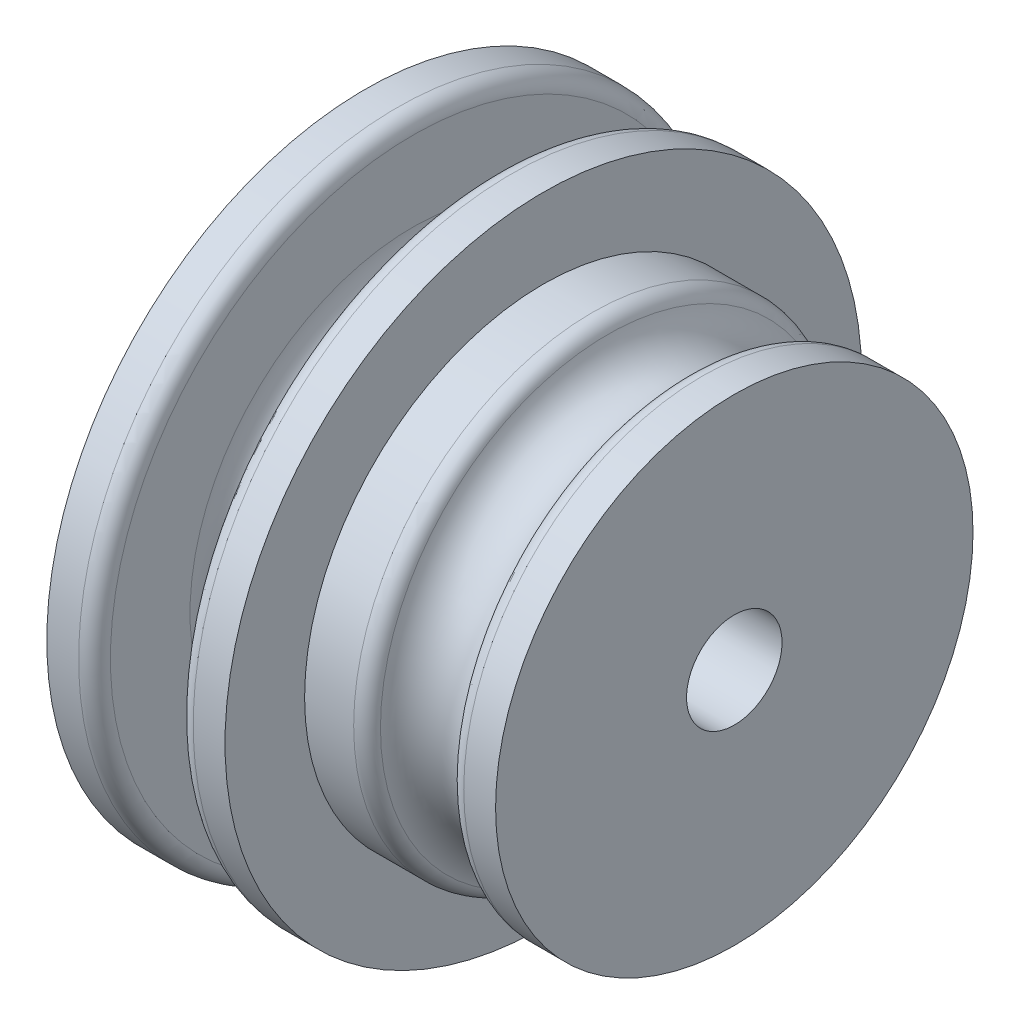
ISO-10303-21;
HEADER;
FILE_DESCRIPTION(('STEP AP214'),'2;1');
FILE_NAME('part.step','',(''),(''),'','','');
FILE_SCHEMA(('AUTOMOTIVE_DESIGN { 1 0 10303 214 1 1 1 1 }'));
ENDSEC;
DATA;
#1=APPLICATION_CONTEXT('core data for automotive mechanical design processes');
#2=APPLICATION_PROTOCOL_DEFINITION('international standard','automotive_design',2000,#1);
#3=PRODUCT_CONTEXT('',#1,'mechanical');
#4=PRODUCT('Part','Part','',(#3));
#5=PRODUCT_RELATED_PRODUCT_CATEGORY('part','',(#4));
#6=PRODUCT_DEFINITION_FORMATION('','',#4);
#7=PRODUCT_DEFINITION_CONTEXT('part definition',#1,'design');
#8=PRODUCT_DEFINITION('design','',#6,#7);
#9=PRODUCT_DEFINITION_SHAPE('','',#8);
#10=(LENGTH_UNIT() NAMED_UNIT(*) SI_UNIT(.MILLI.,.METRE.));
#11=(NAMED_UNIT(*) PLANE_ANGLE_UNIT() SI_UNIT($,.RADIAN.));
#12=(NAMED_UNIT(*) SI_UNIT($,.STERADIAN.) SOLID_ANGLE_UNIT());
#13=UNCERTAINTY_MEASURE_WITH_UNIT(LENGTH_MEASURE(1.E-05),#10,'distance_accuracy_value','');
#14=(GEOMETRIC_REPRESENTATION_CONTEXT(3) GLOBAL_UNCERTAINTY_ASSIGNED_CONTEXT((#13)) GLOBAL_UNIT_ASSIGNED_CONTEXT((#10,
#11,#12)) REPRESENTATION_CONTEXT('',''));
#15=CARTESIAN_POINT('',(0.,0.,0.));
#16=DIRECTION('',(0.,0.,1.));
#17=DIRECTION('',(1.,0.,0.));
#18=AXIS2_PLACEMENT_3D('',#15,#16,#17);
#19=CARTESIAN_POINT('',(4.6,0.,0.));
#20=DIRECTION('',(1.,0.,0.));
#21=DIRECTION('',(0.,0.,-1.));
#22=AXIS2_PLACEMENT_3D('',#19,#20,#21);
#23=TOROIDAL_SURFACE('',#22,9.5,0.5);
#24=CARTESIAN_POINT('',(4.1,0.,0.));
#25=DIRECTION('',(1.,0.,0.));
#26=DIRECTION('',(0.,0.,-1.));
#27=AXIS2_PLACEMENT_3D('',#24,#25,#26);
#28=CIRCLE('',#27,9.5);
#29=CARTESIAN_POINT('',(4.1,0.,-9.5));
#30=VERTEX_POINT('',#29);
#31=EDGE_CURVE('E79',#30,#30,#28,.T.);
#32=ORIENTED_EDGE('',*,*,#31,.T.);
#33=EDGE_LOOP('',(#32));
#34=FACE_BOUND('',#33,.T.);
#35=CARTESIAN_POINT('',(4.6,0.,0.));
#36=DIRECTION('',(1.,0.,0.));
#37=DIRECTION('',(0.,0.,-1.));
#38=AXIS2_PLACEMENT_3D('',#35,#36,#37);
#39=CIRCLE('',#38,10.);
#40=CARTESIAN_POINT('',(4.6,0.,-10.));
#41=VERTEX_POINT('',#40);
#42=EDGE_CURVE('E48',#41,#41,#39,.T.);
#43=ORIENTED_EDGE('',*,*,#42,.F.);
#44=EDGE_LOOP('',(#43));
#45=FACE_BOUND('',#44,.T.);
#46=ADVANCED_FACE('F45',(#34,#45),#23,.T.);
#47=CARTESIAN_POINT('',(11.6,0.,0.));
#48=DIRECTION('',(1.,0.,0.));
#49=DIRECTION('',(0.,0.,-1.));
#50=AXIS2_PLACEMENT_3D('',#47,#48,#49);
#51=CYLINDRICAL_SURFACE('',#50,10.);
#52=ORIENTED_EDGE('',*,*,#42,.T.);
#53=EDGE_LOOP('',(#52));
#54=FACE_BOUND('',#53,.T.);
#55=CARTESIAN_POINT('',(5.6,0.,0.));
#56=DIRECTION('',(1.,0.,0.));
#57=DIRECTION('',(0.,0.,-1.));
#58=AXIS2_PLACEMENT_3D('',#55,#56,#57);
#59=CIRCLE('',#58,10.);
#60=CARTESIAN_POINT('',(5.6,0.,-10.));
#61=VERTEX_POINT('',#60);
#62=EDGE_CURVE('E58',#61,#61,#59,.T.);
#63=ORIENTED_EDGE('',*,*,#62,.F.);
#64=EDGE_LOOP('',(#63));
#65=FACE_BOUND('',#64,.T.);
#66=ADVANCED_FACE('F108',(#54,#65),#51,.T.);
#67=CARTESIAN_POINT('',(5.6,0.,0.));
#68=DIRECTION('',(1.,0.,0.));
#69=DIRECTION('',(0.,0.,-1.));
#70=AXIS2_PLACEMENT_3D('',#67,#68,#69);
#71=PLANE('',#70);
#72=CARTESIAN_POINT('',(5.59999999999999,0.,0.));
#73=DIRECTION('',(1.,0.,0.));
#74=DIRECTION('',(0.,0.,-1.));
#75=AXIS2_PLACEMENT_3D('',#72,#73,#74);
#76=CIRCLE('',#75,7.5);
#77=CARTESIAN_POINT('',(5.59999999999999,0.,-7.5));
#78=VERTEX_POINT('',#77);
#79=EDGE_CURVE('E10',#78,#78,#76,.T.);
#80=ORIENTED_EDGE('',*,*,#79,.F.);
#81=EDGE_LOOP('',(#80));
#82=FACE_BOUND('',#81,.T.);
#83=ORIENTED_EDGE('',*,*,#62,.T.);
#84=EDGE_LOOP('',(#83));
#85=FACE_BOUND('',#84,.T.);
#86=ADVANCED_FACE('F106',(#82,#85),#71,.T.);
#87=CARTESIAN_POINT('',(0.,0.,0.));
#88=DIRECTION('',(-1.,0.,0.));
#89=DIRECTION('',(0.,0.,1.));
#90=AXIS2_PLACEMENT_3D('',#87,#88,#89);
#91=PLANE('',#90);
#92=CARTESIAN_POINT('',(0.,0.,0.));
#93=DIRECTION('',(1.,0.,0.));
#94=DIRECTION('',(0.,0.,-1.));
#95=AXIS2_PLACEMENT_3D('',#92,#93,#94);
#96=CIRCLE('',#95,1.5);
#97=CARTESIAN_POINT('',(0.,0.,-1.5));
#98=VERTEX_POINT('',#97);
#99=EDGE_CURVE('E177',#98,#98,#96,.T.);
#100=ORIENTED_EDGE('',*,*,#99,.T.);
#101=EDGE_LOOP('',(#100));
#102=FACE_BOUND('',#101,.T.);
#103=CARTESIAN_POINT('',(0.,0.,0.));
#104=DIRECTION('',(1.,0.,0.));
#105=DIRECTION('',(0.,0.,-1.));
#106=AXIS2_PLACEMENT_3D('',#103,#104,#105);
#107=CIRCLE('',#106,10.);
#108=CARTESIAN_POINT('',(0.,0.,-10.));
#109=VERTEX_POINT('',#108);
#110=EDGE_CURVE('E99',#109,#109,#107,.T.);
#111=ORIENTED_EDGE('',*,*,#110,.F.);
#112=EDGE_LOOP('',(#111));
#113=FACE_BOUND('',#112,.T.);
#114=ADVANCED_FACE('F116',(#102,#113),#91,.T.);
#115=CARTESIAN_POINT('',(11.6,0.,0.));
#116=DIRECTION('',(1.,0.,0.));
#117=DIRECTION('',(0.,0.,-1.));
#118=AXIS2_PLACEMENT_3D('',#115,#116,#117);
#119=CYLINDRICAL_SURFACE('',#118,10.);
#120=ORIENTED_EDGE('',*,*,#110,.T.);
#121=EDGE_LOOP('',(#120));
#122=FACE_BOUND('',#121,.T.);
#123=CARTESIAN_POINT('',(1.,0.,0.));
#124=DIRECTION('',(1.,0.,0.));
#125=DIRECTION('',(0.,0.,-1.));
#126=AXIS2_PLACEMENT_3D('',#123,#124,#125);
#127=CIRCLE('',#126,10.);
#128=CARTESIAN_POINT('',(1.,0.,-10.));
#129=VERTEX_POINT('',#128);
#130=EDGE_CURVE('E95',#129,#129,#127,.T.);
#131=ORIENTED_EDGE('',*,*,#130,.F.);
#132=EDGE_LOOP('',(#131));
#133=FACE_BOUND('',#132,.T.);
#134=ADVANCED_FACE('F123',(#122,#133),#119,.T.);
#135=CARTESIAN_POINT('',(1.,0.,0.));
#136=DIRECTION('',(1.,0.,0.));
#137=DIRECTION('',(0.,0.,-1.));
#138=AXIS2_PLACEMENT_3D('',#135,#136,#137);
#139=TOROIDAL_SURFACE('',#138,9.5,0.499999999999999);
#140=ORIENTED_EDGE('',*,*,#130,.T.);
#141=EDGE_LOOP('',(#140));
#142=FACE_BOUND('',#141,.T.);
#143=CARTESIAN_POINT('',(1.5,0.,0.));
#144=DIRECTION('',(1.,0.,0.));
#145=DIRECTION('',(0.,0.,-1.));
#146=AXIS2_PLACEMENT_3D('',#143,#144,#145);
#147=CIRCLE('',#146,9.5);
#148=CARTESIAN_POINT('',(1.5,0.,-9.5));
#149=VERTEX_POINT('',#148);
#150=EDGE_CURVE('E91',#149,#149,#147,.T.);
#151=ORIENTED_EDGE('',*,*,#150,.F.);
#152=EDGE_LOOP('',(#151));
#153=FACE_BOUND('',#152,.T.);
#154=ADVANCED_FACE('F126',(#142,#153),#139,.T.);
#155=CARTESIAN_POINT('',(1.5,0.,0.));
#156=DIRECTION('',(1.,0.,0.));
#157=DIRECTION('',(0.,0.,-1.));
#158=AXIS2_PLACEMENT_3D('',#155,#156,#157);
#159=PLANE('',#158);
#160=ORIENTED_EDGE('',*,*,#150,.T.);
#161=EDGE_LOOP('',(#160));
#162=FACE_BOUND('',#161,.T.);
#163=CARTESIAN_POINT('',(1.5,0.,0.));
#164=DIRECTION('',(1.,0.,0.));
#165=DIRECTION('',(0.,0.,-1.));
#166=AXIS2_PLACEMENT_3D('',#163,#164,#165);
#167=CIRCLE('',#166,7.);
#168=CARTESIAN_POINT('',(1.5,0.,-7.));
#169=VERTEX_POINT('',#168);
#170=EDGE_CURVE('E87',#169,#169,#167,.T.);
#171=ORIENTED_EDGE('',*,*,#170,.F.);
#172=EDGE_LOOP('',(#171));
#173=FACE_BOUND('',#172,.T.);
#174=ADVANCED_FACE('F130',(#162,#173),#159,.T.);
#175=CARTESIAN_POINT('',(2.8,0.,0.));
#176=DIRECTION('',(1.,0.,0.));
#177=DIRECTION('',(0.,0.,-1.));
#178=AXIS2_PLACEMENT_3D('',#175,#176,#177);
#179=TOROIDAL_SURFACE('',#178,7.,1.3);
#180=ORIENTED_EDGE('',*,*,#170,.T.);
#181=EDGE_LOOP('',(#180));
#182=FACE_BOUND('',#181,.T.);
#183=CARTESIAN_POINT('',(4.1,0.,0.));
#184=DIRECTION('',(1.,0.,0.));
#185=DIRECTION('',(0.,0.,-1.));
#186=AXIS2_PLACEMENT_3D('',#183,#184,#185);
#187=CIRCLE('',#186,7.);
#188=CARTESIAN_POINT('',(4.1,0.,-7.));
#189=VERTEX_POINT('',#188);
#190=EDGE_CURVE('E83',#189,#189,#187,.T.);
#191=ORIENTED_EDGE('',*,*,#190,.F.);
#192=EDGE_LOOP('',(#191));
#193=FACE_BOUND('',#192,.T.);
#194=ADVANCED_FACE('F134',(#182,#193),#179,.F.);
#195=CARTESIAN_POINT('',(4.1,0.,0.));
#196=DIRECTION('',(-1.,0.,0.));
#197=DIRECTION('',(0.,0.,1.));
#198=AXIS2_PLACEMENT_3D('',#195,#196,#197);
#199=PLANE('',#198);
#200=ORIENTED_EDGE('',*,*,#190,.T.);
#201=EDGE_LOOP('',(#200));
#202=FACE_BOUND('',#201,.T.);
#203=ORIENTED_EDGE('',*,*,#31,.F.);
#204=EDGE_LOOP('',(#203));
#205=FACE_BOUND('',#204,.T.);
#206=ADVANCED_FACE('F138',(#202,#205),#199,.T.);
#207=CARTESIAN_POINT('',(7.14167670684188,0.,0.));
#208=DIRECTION('',(1.,0.,0.));
#209=DIRECTION('',(0.,0.,-1.));
#210=AXIS2_PLACEMENT_3D('',#207,#208,#209);
#211=TOROIDAL_SURFACE('',#210,7.,0.500000000000001);
#212=CARTESIAN_POINT('',(7.14167670684188,0.,0.));
#213=DIRECTION('',(1.,0.,0.));
#214=DIRECTION('',(0.,0.,-1.));
#215=AXIS2_PLACEMENT_3D('',#212,#213,#214);
#216=CIRCLE('',#215,7.5);
#217=CARTESIAN_POINT('',(7.14167670684188,0.,-7.5));
#218=VERTEX_POINT('',#217);
#219=EDGE_CURVE('E61',#218,#218,#216,.T.);
#220=ORIENTED_EDGE('',*,*,#219,.T.);
#221=EDGE_LOOP('',(#220));
#222=FACE_BOUND('',#221,.T.);
#223=CARTESIAN_POINT('',(7.62199938644717,0.,0.));
#224=DIRECTION('',(1.,0.,0.));
#225=DIRECTION('',(0.,0.,-1.));
#226=AXIS2_PLACEMENT_3D('',#223,#224,#225);
#227=CIRCLE('',#226,7.13888888888889);
#228=CARTESIAN_POINT('',(7.62199938644717,0.,-7.13888888888889));
#229=VERTEX_POINT('',#228);
#230=EDGE_CURVE('E75',#229,#229,#227,.T.);
#231=ORIENTED_EDGE('',*,*,#230,.F.);
#232=EDGE_LOOP('',(#231));
#233=FACE_BOUND('',#232,.T.);
#234=ADVANCED_FACE('F142',(#222,#233),#211,.T.);
#235=CARTESIAN_POINT('',(8.87083835342094,0.,0.));
#236=DIRECTION('',(1.,0.,0.));
#237=DIRECTION('',(0.,0.,-1.));
#238=AXIS2_PLACEMENT_3D('',#235,#236,#237);
#239=TOROIDAL_SURFACE('',#238,7.5,1.3);
#240=ORIENTED_EDGE('',*,*,#230,.T.);
#241=EDGE_LOOP('',(#240));
#242=FACE_BOUND('',#241,.T.);
#243=CARTESIAN_POINT('',(10.1196773203947,0.,0.));
#244=DIRECTION('',(1.,0.,0.));
#245=DIRECTION('',(0.,0.,-1.));
#246=AXIS2_PLACEMENT_3D('',#243,#244,#245);
#247=CIRCLE('',#246,7.13888888888889);
#248=CARTESIAN_POINT('',(10.1196773203947,0.,-7.13888888888889));
#249=VERTEX_POINT('',#248);
#250=EDGE_CURVE('E71',#249,#249,#247,.T.);
#251=ORIENTED_EDGE('',*,*,#250,.F.);
#252=EDGE_LOOP('',(#251));
#253=FACE_BOUND('',#252,.T.);
#254=ADVANCED_FACE('F146',(#242,#253),#239,.F.);
#255=CARTESIAN_POINT('',(10.6,0.,0.));
#256=DIRECTION('',(1.,0.,0.));
#257=DIRECTION('',(0.,0.,-1.));
#258=AXIS2_PLACEMENT_3D('',#255,#256,#257);
#259=TOROIDAL_SURFACE('',#258,7.,0.5);
#260=ORIENTED_EDGE('',*,*,#250,.T.);
#261=EDGE_LOOP('',(#260));
#262=FACE_BOUND('',#261,.T.);
#263=CARTESIAN_POINT('',(10.6,0.,0.));
#264=DIRECTION('',(1.,0.,0.));
#265=DIRECTION('',(0.,0.,-1.));
#266=AXIS2_PLACEMENT_3D('',#263,#264,#265);
#267=CIRCLE('',#266,7.5);
#268=CARTESIAN_POINT('',(10.6,0.,-7.5));
#269=VERTEX_POINT('',#268);
#270=EDGE_CURVE('E67',#269,#269,#267,.T.);
#271=ORIENTED_EDGE('',*,*,#270,.F.);
#272=EDGE_LOOP('',(#271));
#273=FACE_BOUND('',#272,.T.);
#274=ADVANCED_FACE('F150',(#262,#273),#259,.T.);
#275=CARTESIAN_POINT('',(11.6,0.,0.));
#276=DIRECTION('',(1.,0.,0.));
#277=DIRECTION('',(0.,0.,-1.));
#278=AXIS2_PLACEMENT_3D('',#275,#276,#277);
#279=CYLINDRICAL_SURFACE('',#278,7.5);
#280=ORIENTED_EDGE('',*,*,#270,.T.);
#281=EDGE_LOOP('',(#280));
#282=FACE_BOUND('',#281,.T.);
#283=CARTESIAN_POINT('',(11.6,0.,0.));
#284=DIRECTION('',(1.,0.,0.));
#285=DIRECTION('',(0.,0.,-1.));
#286=AXIS2_PLACEMENT_3D('',#283,#284,#285);
#287=CIRCLE('',#286,7.5);
#288=CARTESIAN_POINT('',(11.6,0.,-7.5));
#289=VERTEX_POINT('',#288);
#290=EDGE_CURVE('E63',#289,#289,#287,.T.);
#291=ORIENTED_EDGE('',*,*,#290,.F.);
#292=EDGE_LOOP('',(#291));
#293=FACE_BOUND('',#292,.T.);
#294=ADVANCED_FACE('F154',(#282,#293),#279,.T.);
#295=CARTESIAN_POINT('',(11.6,0.,0.));
#296=DIRECTION('',(1.,0.,0.));
#297=DIRECTION('',(0.,0.,-1.));
#298=AXIS2_PLACEMENT_3D('',#295,#296,#297);
#299=PLANE('',#298);
#300=CARTESIAN_POINT('',(11.6,0.,0.));
#301=DIRECTION('',(1.,0.,0.));
#302=DIRECTION('',(0.,0.,-1.));
#303=AXIS2_PLACEMENT_3D('',#300,#301,#302);
#304=CIRCLE('',#303,1.5);
#305=CARTESIAN_POINT('',(11.6,0.,-1.5));
#306=VERTEX_POINT('',#305);
#307=EDGE_CURVE('E174',#306,#306,#304,.T.);
#308=ORIENTED_EDGE('',*,*,#307,.F.);
#309=EDGE_LOOP('',(#308));
#310=FACE_BOUND('',#309,.T.);
#311=ORIENTED_EDGE('',*,*,#290,.T.);
#312=EDGE_LOOP('',(#311));
#313=FACE_BOUND('',#312,.T.);
#314=ADVANCED_FACE('F158',(#310,#313),#299,.T.);
#315=CARTESIAN_POINT('',(11.6,0.,0.));
#316=DIRECTION('',(1.,0.,0.));
#317=DIRECTION('',(0.,0.,-1.));
#318=AXIS2_PLACEMENT_3D('',#315,#316,#317);
#319=CYLINDRICAL_SURFACE('',#318,7.5);
#320=ORIENTED_EDGE('',*,*,#79,.T.);
#321=EDGE_LOOP('',(#320));
#322=FACE_BOUND('',#321,.T.);
#323=ORIENTED_EDGE('',*,*,#219,.F.);
#324=EDGE_LOOP('',(#323));
#325=FACE_BOUND('',#324,.T.);
#326=ADVANCED_FACE('F162',(#322,#325),#319,.T.);
#327=CARTESIAN_POINT('',(11.6,0.,0.));
#328=DIRECTION('',(-1.,0.,0.));
#329=DIRECTION('',(0.,0.,1.));
#330=AXIS2_PLACEMENT_3D('',#327,#328,#329);
#331=CYLINDRICAL_SURFACE('',#330,1.5);
#332=ORIENTED_EDGE('',*,*,#307,.T.);
#333=EDGE_LOOP('',(#332));
#334=FACE_BOUND('',#333,.T.);
#335=ORIENTED_EDGE('',*,*,#99,.F.);
#336=EDGE_LOOP('',(#335));
#337=FACE_BOUND('',#336,.T.);
#338=ADVANCED_FACE('F166',(#334,#337),#331,.F.);
#339=CLOSED_SHELL('',(#46,#66,#86,#114,#134,#154,#174,#194,#206,#234,#254,#274,#294,#314,#326,#338));
#340=MANIFOLD_SOLID_BREP('B2',#339);
#341=ADVANCED_BREP_SHAPE_REPRESENTATION('',(#18,#340),#14);
#342=SHAPE_DEFINITION_REPRESENTATION(#9,#341);
ENDSEC;
END-ISO-10303-21;
